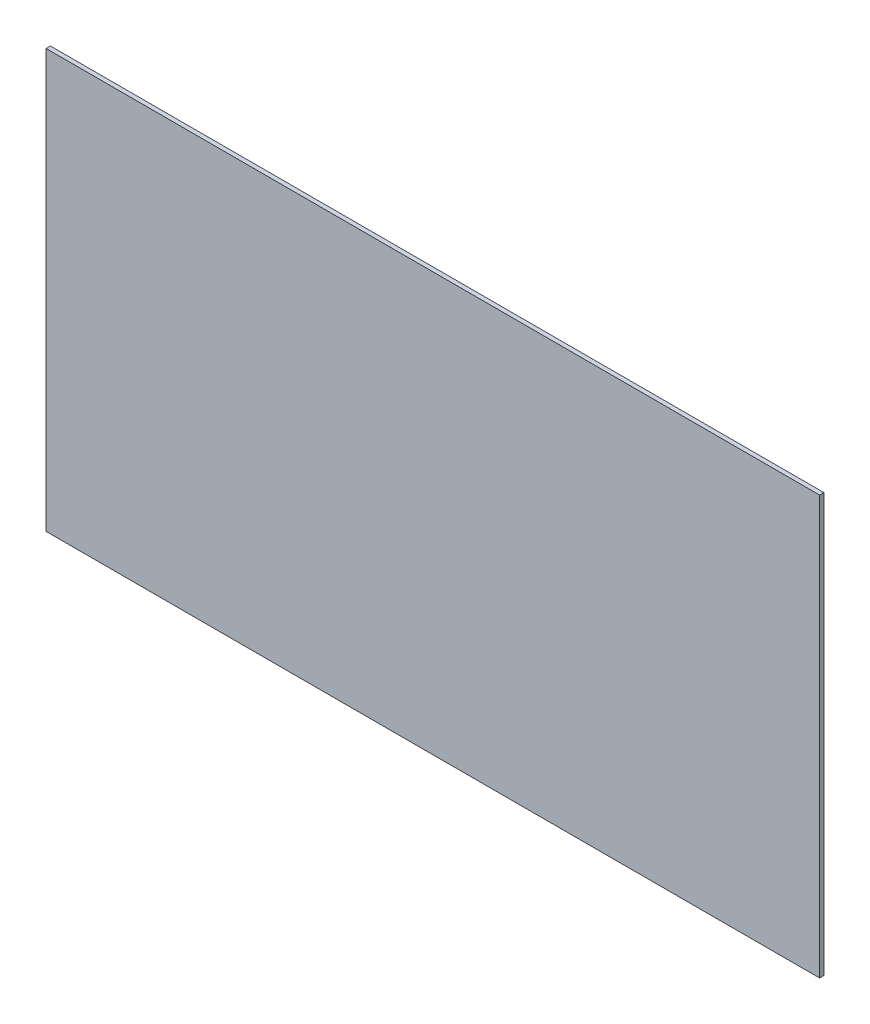
ISO-10303-21;
HEADER;
FILE_DESCRIPTION(('STEP AP214'),'2;1');
FILE_NAME('part.step','',(''),(''),'','','');
FILE_SCHEMA(('AUTOMOTIVE_DESIGN { 1 0 10303 214 1 1 1 1 }'));
ENDSEC;
DATA;
#1=APPLICATION_CONTEXT('core data for automotive mechanical design processes');
#2=APPLICATION_PROTOCOL_DEFINITION('international standard','automotive_design',2000,#1);
#3=PRODUCT_CONTEXT('',#1,'mechanical');
#4=PRODUCT('Part','Part','',(#3));
#5=PRODUCT_RELATED_PRODUCT_CATEGORY('part','',(#4));
#6=PRODUCT_DEFINITION_FORMATION('','',#4);
#7=PRODUCT_DEFINITION_CONTEXT('part definition',#1,'design');
#8=PRODUCT_DEFINITION('design','',#6,#7);
#9=PRODUCT_DEFINITION_SHAPE('','',#8);
#10=(LENGTH_UNIT() NAMED_UNIT(*) SI_UNIT(.MILLI.,.METRE.));
#11=(NAMED_UNIT(*) PLANE_ANGLE_UNIT() SI_UNIT($,.RADIAN.));
#12=(NAMED_UNIT(*) SI_UNIT($,.STERADIAN.) SOLID_ANGLE_UNIT());
#13=UNCERTAINTY_MEASURE_WITH_UNIT(LENGTH_MEASURE(1.E-05),#10,'distance_accuracy_value','');
#14=(GEOMETRIC_REPRESENTATION_CONTEXT(3) GLOBAL_UNCERTAINTY_ASSIGNED_CONTEXT((#13)) GLOBAL_UNIT_ASSIGNED_CONTEXT((#10,
#11,#12)) REPRESENTATION_CONTEXT('',''));
#15=CARTESIAN_POINT('',(0.,0.,0.));
#16=DIRECTION('',(0.,0.,1.));
#17=DIRECTION('',(1.,0.,0.));
#18=AXIS2_PLACEMENT_3D('',#15,#16,#17);
#19=CARTESIAN_POINT('',(-11.2291125589918,-292.,3.));
#20=DIRECTION('',(-1.,0.,0.));
#21=DIRECTION('',(0.,0.,1.));
#22=AXIS2_PLACEMENT_3D('',#19,#20,#21);
#23=PLANE('',#22);
#24=DIRECTION('',(0.,1.,0.));
#25=VECTOR('',#24,1.);
#26=CARTESIAN_POINT('',(-11.2291125589918,-292.,0.));
#27=LINE('',#26,#25);
#28=CARTESIAN_POINT('',(-11.2291125589918,-292.,0.));
#29=VERTEX_POINT('',#28);
#30=CARTESIAN_POINT('',(-11.2291125589918,0.,0.));
#31=VERTEX_POINT('',#30);
#32=EDGE_CURVE('E99',#29,#31,#27,.T.);
#33=ORIENTED_EDGE('',*,*,#32,.T.);
#34=DIRECTION('',(0.,0.,-1.));
#35=VECTOR('',#34,1.);
#36=CARTESIAN_POINT('',(-11.2291125589918,0.,3.));
#37=LINE('',#36,#35);
#38=CARTESIAN_POINT('',(-11.2291125589918,0.,3.));
#39=VERTEX_POINT('',#38);
#40=EDGE_CURVE('E11',#39,#31,#37,.T.);
#41=ORIENTED_EDGE('',*,*,#40,.F.);
#42=DIRECTION('',(0.,1.,0.));
#43=VECTOR('',#42,1.);
#44=CARTESIAN_POINT('',(-11.2291125589918,-292.,3.));
#45=LINE('',#44,#43);
#46=CARTESIAN_POINT('',(-11.2291125589918,-292.,3.));
#47=VERTEX_POINT('',#46);
#48=EDGE_CURVE('E87',#47,#39,#45,.T.);
#49=ORIENTED_EDGE('',*,*,#48,.F.);
#50=DIRECTION('',(0.,0.,-1.));
#51=VECTOR('',#50,1.);
#52=CARTESIAN_POINT('',(-11.2291125589918,-292.,3.));
#53=LINE('',#52,#51);
#54=EDGE_CURVE('E95',#47,#29,#53,.T.);
#55=ORIENTED_EDGE('',*,*,#54,.T.);
#56=EDGE_LOOP('',(#33,#41,#49,#55));
#57=FACE_BOUND('',#56,.T.);
#58=ADVANCED_FACE('F36',(#57),#23,.F.);
#59=CARTESIAN_POINT('',(-11.2291125589918,0.,3.));
#60=DIRECTION('',(0.,-1.,0.));
#61=DIRECTION('',(0.,0.,-1.));
#62=AXIS2_PLACEMENT_3D('',#59,#60,#61);
#63=PLANE('',#62);
#64=DIRECTION('',(-1.,0.,0.));
#65=VECTOR('',#64,1.);
#66=CARTESIAN_POINT('',(-11.2291125589918,0.,0.));
#67=LINE('',#66,#65);
#68=CARTESIAN_POINT('',(-551.229112558992,0.,0.));
#69=VERTEX_POINT('',#68);
#70=EDGE_CURVE('E91',#31,#69,#67,.T.);
#71=ORIENTED_EDGE('',*,*,#70,.T.);
#72=DIRECTION('',(0.,0.,-1.));
#73=VECTOR('',#72,1.);
#74=CARTESIAN_POINT('',(-551.229112558992,0.,3.));
#75=LINE('',#74,#73);
#76=CARTESIAN_POINT('',(-551.229112558992,0.,3.));
#77=VERTEX_POINT('',#76);
#78=EDGE_CURVE('E44',#77,#69,#75,.T.);
#79=ORIENTED_EDGE('',*,*,#78,.F.);
#80=DIRECTION('',(-1.,0.,0.));
#81=VECTOR('',#80,1.);
#82=CARTESIAN_POINT('',(-11.2291125589918,0.,3.));
#83=LINE('',#82,#81);
#84=EDGE_CURVE('E82',#39,#77,#83,.T.);
#85=ORIENTED_EDGE('',*,*,#84,.F.);
#86=ORIENTED_EDGE('',*,*,#40,.T.);
#87=EDGE_LOOP('',(#71,#79,#85,#86));
#88=FACE_BOUND('',#87,.T.);
#89=ADVANCED_FACE('F90',(#88),#63,.F.);
#90=CARTESIAN_POINT('',(-551.229112558992,-292.,3.));
#91=DIRECTION('',(1.,0.,0.));
#92=DIRECTION('',(0.,0.,-1.));
#93=AXIS2_PLACEMENT_3D('',#90,#91,#92);
#94=PLANE('',#93);
#95=DIRECTION('',(0.,-1.,0.));
#96=VECTOR('',#95,1.);
#97=CARTESIAN_POINT('',(-551.229112558992,-292.,0.));
#98=LINE('',#97,#96);
#99=CARTESIAN_POINT('',(-551.229112558992,-292.,0.));
#100=VERTEX_POINT('',#99);
#101=EDGE_CURVE('E69',#69,#100,#98,.T.);
#102=ORIENTED_EDGE('',*,*,#101,.T.);
#103=DIRECTION('',(0.,0.,-1.));
#104=VECTOR('',#103,1.);
#105=CARTESIAN_POINT('',(-551.229112558992,-292.,3.));
#106=LINE('',#105,#104);
#107=CARTESIAN_POINT('',(-551.229112558992,-292.,3.));
#108=VERTEX_POINT('',#107);
#109=EDGE_CURVE('E92',#108,#100,#106,.T.);
#110=ORIENTED_EDGE('',*,*,#109,.F.);
#111=DIRECTION('',(0.,-1.,0.));
#112=VECTOR('',#111,1.);
#113=CARTESIAN_POINT('',(-551.229112558992,-292.,3.));
#114=LINE('',#113,#112);
#115=EDGE_CURVE('E85',#77,#108,#114,.T.);
#116=ORIENTED_EDGE('',*,*,#115,.F.);
#117=ORIENTED_EDGE('',*,*,#78,.T.);
#118=EDGE_LOOP('',(#102,#110,#116,#117));
#119=FACE_BOUND('',#118,.T.);
#120=ADVANCED_FACE('F93',(#119),#94,.F.);
#121=CARTESIAN_POINT('',(-11.2291125589918,-292.,3.));
#122=DIRECTION('',(0.,1.,0.));
#123=DIRECTION('',(0.,0.,1.));
#124=AXIS2_PLACEMENT_3D('',#121,#122,#123);
#125=PLANE('',#124);
#126=DIRECTION('',(1.,0.,0.));
#127=VECTOR('',#126,1.);
#128=CARTESIAN_POINT('',(-11.2291125589918,-292.,0.));
#129=LINE('',#128,#127);
#130=EDGE_CURVE('E75',#100,#29,#129,.T.);
#131=ORIENTED_EDGE('',*,*,#130,.T.);
#132=ORIENTED_EDGE('',*,*,#54,.F.);
#133=DIRECTION('',(1.,0.,0.));
#134=VECTOR('',#133,1.);
#135=CARTESIAN_POINT('',(-11.2291125589918,-292.,3.));
#136=LINE('',#135,#134);
#137=EDGE_CURVE('E52',#108,#47,#136,.T.);
#138=ORIENTED_EDGE('',*,*,#137,.F.);
#139=ORIENTED_EDGE('',*,*,#109,.T.);
#140=EDGE_LOOP('',(#131,#132,#138,#139));
#141=FACE_BOUND('',#140,.T.);
#142=ADVANCED_FACE('F106',(#141),#125,.F.);
#143=CARTESIAN_POINT('',(0.,0.,3.));
#144=DIRECTION('',(0.,0.,1.));
#145=DIRECTION('',(1.,0.,0.));
#146=AXIS2_PLACEMENT_3D('',#143,#144,#145);
#147=PLANE('',#146);
#148=ORIENTED_EDGE('',*,*,#48,.T.);
#149=ORIENTED_EDGE('',*,*,#84,.T.);
#150=ORIENTED_EDGE('',*,*,#115,.T.);
#151=ORIENTED_EDGE('',*,*,#137,.T.);
#152=EDGE_LOOP('',(#148,#149,#150,#151));
#153=FACE_BOUND('',#152,.T.);
#154=ADVANCED_FACE('F83',(#153),#147,.T.);
#155=CARTESIAN_POINT('',(0.,0.,0.));
#156=DIRECTION('',(0.,0.,1.));
#157=DIRECTION('',(1.,0.,0.));
#158=AXIS2_PLACEMENT_3D('',#155,#156,#157);
#159=PLANE('',#158);
#160=ORIENTED_EDGE('',*,*,#32,.F.);
#161=ORIENTED_EDGE('',*,*,#130,.F.);
#162=ORIENTED_EDGE('',*,*,#101,.F.);
#163=ORIENTED_EDGE('',*,*,#70,.F.);
#164=EDGE_LOOP('',(#160,#161,#162,#163));
#165=FACE_BOUND('',#164,.T.);
#166=ADVANCED_FACE('F109',(#165),#159,.F.);
#167=CLOSED_SHELL('',(#58,#89,#120,#142,#154,#166));
#168=MANIFOLD_SOLID_BREP('B2',#167);
#169=ADVANCED_BREP_SHAPE_REPRESENTATION('',(#18,#168),#14);
#170=SHAPE_DEFINITION_REPRESENTATION(#9,#169);
ENDSEC;
END-ISO-10303-21;
